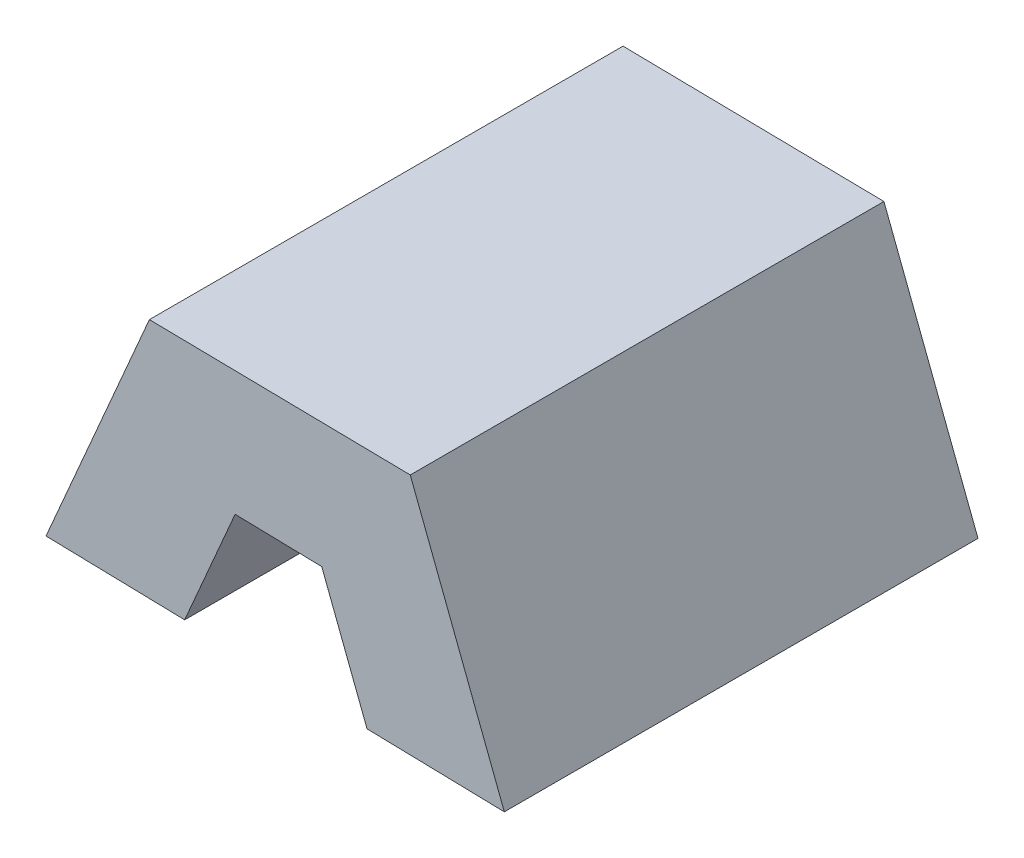
ISO-10303-21;
HEADER;
FILE_DESCRIPTION(('STEP AP214'),'2;1');
FILE_NAME('part.step','',(''),(''),'','','');
FILE_SCHEMA(('AUTOMOTIVE_DESIGN { 1 0 10303 214 1 1 1 1 }'));
ENDSEC;
DATA;
#1=APPLICATION_CONTEXT('core data for automotive mechanical design processes');
#2=APPLICATION_PROTOCOL_DEFINITION('international standard','automotive_design',2000,#1);
#3=PRODUCT_CONTEXT('',#1,'mechanical');
#4=PRODUCT('Part','Part','',(#3));
#5=PRODUCT_RELATED_PRODUCT_CATEGORY('part','',(#4));
#6=PRODUCT_DEFINITION_FORMATION('','',#4);
#7=PRODUCT_DEFINITION_CONTEXT('part definition',#1,'design');
#8=PRODUCT_DEFINITION('design','',#6,#7);
#9=PRODUCT_DEFINITION_SHAPE('','',#8);
#10=(LENGTH_UNIT() NAMED_UNIT(*) SI_UNIT(.MILLI.,.METRE.));
#11=(NAMED_UNIT(*) PLANE_ANGLE_UNIT() SI_UNIT($,.RADIAN.));
#12=(NAMED_UNIT(*) SI_UNIT($,.STERADIAN.) SOLID_ANGLE_UNIT());
#13=UNCERTAINTY_MEASURE_WITH_UNIT(LENGTH_MEASURE(1.E-05),#10,'distance_accuracy_value','');
#14=(GEOMETRIC_REPRESENTATION_CONTEXT(3) GLOBAL_UNCERTAINTY_ASSIGNED_CONTEXT((#13)) GLOBAL_UNIT_ASSIGNED_CONTEXT((#10,
#11,#12)) REPRESENTATION_CONTEXT('',''));
#15=CARTESIAN_POINT('',(0.,0.,0.));
#16=DIRECTION('',(0.,0.,1.));
#17=DIRECTION('',(1.,0.,0.));
#18=AXIS2_PLACEMENT_3D('',#15,#16,#17);
#19=CARTESIAN_POINT('',(5.710139457628,1.240783037333,0.));
#20=DIRECTION('',(-0.917874415525835,0.396870958024277,0.));
#21=DIRECTION('',(-0.396870958024277,-0.917874415525835,0.));
#22=AXIS2_PLACEMENT_3D('',#19,#20,#21);
#23=PLANE('',#22);
#24=DIRECTION('',(-0.396870958024277,-0.917874415525835,0.));
#25=VECTOR('',#24,1.);
#26=CARTESIAN_POINT('',(5.710139457628,1.240783037333,0.));
#27=LINE('',#26,#25);
#28=CARTESIAN_POINT('',(5.710139457628,1.240783037333,0.));
#29=VERTEX_POINT('',#28);
#30=CARTESIAN_POINT('',(5.688309723282,1.190295708267,0.));
#31=VERTEX_POINT('',#30);
#32=EDGE_CURVE('E11',#29,#31,#27,.T.);
#33=ORIENTED_EDGE('',*,*,#32,.T.);
#34=DIRECTION('',(0.,0.,1.));
#35=VECTOR('',#34,1.);
#36=CARTESIAN_POINT('',(5.688309723282,1.190295708267,0.));
#37=LINE('',#36,#35);
#38=CARTESIAN_POINT('',(5.688309723282,1.190295708267,0.1));
#39=VERTEX_POINT('',#38);
#40=EDGE_CURVE('E24',#31,#39,#37,.T.);
#41=ORIENTED_EDGE('',*,*,#40,.T.);
#42=DIRECTION('',(-0.396870958024277,-0.917874415525835,0.));
#43=VECTOR('',#42,1.);
#44=CARTESIAN_POINT('',(5.710139457628,1.240783037333,0.1));
#45=LINE('',#44,#43);
#46=CARTESIAN_POINT('',(5.710139457628,1.240783037333,0.1));
#47=VERTEX_POINT('',#46);
#48=EDGE_CURVE('E100',#47,#39,#45,.T.);
#49=ORIENTED_EDGE('',*,*,#48,.F.);
#50=DIRECTION('',(0.,0.,1.));
#51=VECTOR('',#50,1.);
#52=CARTESIAN_POINT('',(5.710139457628,1.240783037333,0.));
#53=LINE('',#52,#51);
#54=EDGE_CURVE('E146',#29,#47,#53,.T.);
#55=ORIENTED_EDGE('',*,*,#54,.F.);
#56=EDGE_LOOP('',(#33,#41,#49,#55));
#57=FACE_BOUND('',#56,.T.);
#58=ADVANCED_FACE('F17',(#57),#23,.T.);
#59=CARTESIAN_POINT('',(5.765214409801,1.23991646644,0.));
#60=DIRECTION('',(0.015732444769395,0.999876237432203,0.));
#61=DIRECTION('',(-0.999876237432203,0.015732444769395,0.));
#62=AXIS2_PLACEMENT_3D('',#59,#60,#61);
#63=PLANE('',#62);
#64=DIRECTION('',(-0.999876237432202,0.015732444769395,0.));
#65=VECTOR('',#64,1.);
#66=CARTESIAN_POINT('',(5.765214409801,1.23991646644,0.));
#67=LINE('',#66,#65);
#68=CARTESIAN_POINT('',(5.765214409801,1.23991646644,0.));
#69=VERTEX_POINT('',#68);
#70=EDGE_CURVE('E143',#69,#29,#67,.T.);
#71=ORIENTED_EDGE('',*,*,#70,.T.);
#72=ORIENTED_EDGE('',*,*,#54,.T.);
#73=DIRECTION('',(-0.999876237432202,0.015732444769395,0.));
#74=VECTOR('',#73,1.);
#75=CARTESIAN_POINT('',(5.765214409801,1.23991646644,0.1));
#76=LINE('',#75,#74);
#77=CARTESIAN_POINT('',(5.765214409801,1.23991646644,0.1));
#78=VERTEX_POINT('',#77);
#79=EDGE_CURVE('E141',#78,#47,#76,.T.);
#80=ORIENTED_EDGE('',*,*,#79,.F.);
#81=DIRECTION('',(0.,0.,1.));
#82=VECTOR('',#81,1.);
#83=CARTESIAN_POINT('',(5.765214409801,1.23991646644,0.));
#84=LINE('',#83,#82);
#85=EDGE_CURVE('E138',#69,#78,#84,.T.);
#86=ORIENTED_EDGE('',*,*,#85,.F.);
#87=EDGE_LOOP('',(#71,#72,#80,#86));
#88=FACE_BOUND('',#87,.T.);
#89=ADVANCED_FACE('F163',(#88),#63,.T.);
#90=CARTESIAN_POINT('',(5.785077541977,1.188245252047,0.));
#91=DIRECTION('',(0.933408609369541,0.35881522815346,0.));
#92=DIRECTION('',(-0.35881522815346,0.933408609369541,0.));
#93=AXIS2_PLACEMENT_3D('',#90,#91,#92);
#94=PLANE('',#93);
#95=DIRECTION('',(-0.35881522815346,0.933408609369541,0.));
#96=VECTOR('',#95,1.);
#97=CARTESIAN_POINT('',(5.785077541977,1.188245252047,0.));
#98=LINE('',#97,#96);
#99=CARTESIAN_POINT('',(5.785077541977,1.188245252047,0.));
#100=VERTEX_POINT('',#99);
#101=EDGE_CURVE('E135',#100,#69,#98,.T.);
#102=ORIENTED_EDGE('',*,*,#101,.T.);
#103=ORIENTED_EDGE('',*,*,#85,.T.);
#104=DIRECTION('',(-0.35881522815346,0.933408609369541,0.));
#105=VECTOR('',#104,1.);
#106=CARTESIAN_POINT('',(5.785077541977,1.188245252047,0.1));
#107=LINE('',#106,#105);
#108=CARTESIAN_POINT('',(5.785077541977,1.188245252047,0.1));
#109=VERTEX_POINT('',#108);
#110=EDGE_CURVE('E132',#109,#78,#107,.T.);
#111=ORIENTED_EDGE('',*,*,#110,.F.);
#112=DIRECTION('',(0.,0.,1.));
#113=VECTOR('',#112,1.);
#114=CARTESIAN_POINT('',(5.785077541977,1.188245252047,0.));
#115=LINE('',#114,#113);
#116=EDGE_CURVE('E129',#100,#109,#115,.T.);
#117=ORIENTED_EDGE('',*,*,#116,.F.);
#118=EDGE_LOOP('',(#102,#103,#111,#117));
#119=FACE_BOUND('',#118,.T.);
#120=ADVANCED_FACE('F160',(#119),#94,.T.);
#121=CARTESIAN_POINT('',(5.756089852152,1.188928770704,0.));
#122=DIRECTION('',(-0.023573065766465,-0.999722116675614,0.));
#123=DIRECTION('',(0.999722116675614,-0.023573065766465,0.));
#124=AXIS2_PLACEMENT_3D('',#121,#122,#123);
#125=PLANE('',#124);
#126=DIRECTION('',(0.999722116675614,-0.023573065766465,0.));
#127=VECTOR('',#126,1.);
#128=CARTESIAN_POINT('',(5.756089852152,1.188928770704,0.));
#129=LINE('',#128,#127);
#130=CARTESIAN_POINT('',(5.756089852152,1.188928770704,0.));
#131=VERTEX_POINT('',#130);
#132=EDGE_CURVE('E126',#131,#100,#129,.T.);
#133=ORIENTED_EDGE('',*,*,#132,.T.);
#134=ORIENTED_EDGE('',*,*,#116,.T.);
#135=DIRECTION('',(0.999722116675614,-0.023573065766465,0.));
#136=VECTOR('',#135,1.);
#137=CARTESIAN_POINT('',(5.756089852152,1.188928770704,0.1));
#138=LINE('',#137,#136);
#139=CARTESIAN_POINT('',(5.756089852152,1.188928770704,0.1));
#140=VERTEX_POINT('',#139);
#141=EDGE_CURVE('E123',#140,#109,#138,.T.);
#142=ORIENTED_EDGE('',*,*,#141,.F.);
#143=DIRECTION('',(0.,0.,1.));
#144=VECTOR('',#143,1.);
#145=CARTESIAN_POINT('',(5.756089852152,1.188928770704,0.));
#146=LINE('',#145,#144);
#147=EDGE_CURVE('E120',#131,#140,#146,.T.);
#148=ORIENTED_EDGE('',*,*,#147,.F.);
#149=EDGE_LOOP('',(#133,#134,#142,#148));
#150=FACE_BOUND('',#149,.T.);
#151=ADVANCED_FACE('F157',(#150),#125,.T.);
#152=CARTESIAN_POINT('',(5.746525469888,1.213809199536,0.));
#153=DIRECTION('',(-0.933408609369533,-0.35881522815348,0.));
#154=DIRECTION('',(0.35881522815348,-0.933408609369533,0.));
#155=AXIS2_PLACEMENT_3D('',#152,#153,#154);
#156=PLANE('',#155);
#157=DIRECTION('',(0.35881522815348,-0.933408609369533,0.));
#158=VECTOR('',#157,1.);
#159=CARTESIAN_POINT('',(5.746525469888,1.213809199536,0.));
#160=LINE('',#159,#158);
#161=CARTESIAN_POINT('',(5.746525469888,1.213809199536,0.));
#162=VERTEX_POINT('',#161);
#163=EDGE_CURVE('E117',#162,#131,#160,.T.);
#164=ORIENTED_EDGE('',*,*,#163,.T.);
#165=ORIENTED_EDGE('',*,*,#147,.T.);
#166=DIRECTION('',(0.35881522815348,-0.933408609369533,0.));
#167=VECTOR('',#166,1.);
#168=CARTESIAN_POINT('',(5.746525469888,1.213809199536,0.1));
#169=LINE('',#168,#167);
#170=CARTESIAN_POINT('',(5.746525469888,1.213809199536,0.1));
#171=VERTEX_POINT('',#170);
#172=EDGE_CURVE('E114',#171,#140,#169,.T.);
#173=ORIENTED_EDGE('',*,*,#172,.F.);
#174=DIRECTION('',(0.,0.,1.));
#175=VECTOR('',#174,1.);
#176=CARTESIAN_POINT('',(5.746525469888,1.213809199536,0.));
#177=LINE('',#176,#175);
#178=EDGE_CURVE('E111',#162,#171,#177,.T.);
#179=ORIENTED_EDGE('',*,*,#178,.F.);
#180=EDGE_LOOP('',(#164,#165,#173,#179));
#181=FACE_BOUND('',#180,.T.);
#182=ADVANCED_FACE('F154',(#181),#156,.T.);
#183=CARTESIAN_POINT('',(5.728239292055,1.214240380626,0.));
#184=DIRECTION('',(-0.02357306576646,-0.999722116675614,0.));
#185=DIRECTION('',(0.999722116675614,-0.02357306576646,0.));
#186=AXIS2_PLACEMENT_3D('',#183,#184,#185);
#187=PLANE('',#186);
#188=DIRECTION('',(0.999722116675614,-0.02357306576646,0.));
#189=VECTOR('',#188,1.);
#190=CARTESIAN_POINT('',(5.728239292055,1.214240380626,0.));
#191=LINE('',#190,#189);
#192=CARTESIAN_POINT('',(5.728239292055,1.214240380626,0.));
#193=VERTEX_POINT('',#192);
#194=EDGE_CURVE('E108',#193,#162,#191,.T.);
#195=ORIENTED_EDGE('',*,*,#194,.T.);
#196=ORIENTED_EDGE('',*,*,#178,.T.);
#197=DIRECTION('',(0.999722116675614,-0.02357306576646,0.));
#198=VECTOR('',#197,1.);
#199=CARTESIAN_POINT('',(5.728239292055,1.214240380626,0.1));
#200=LINE('',#199,#198);
#201=CARTESIAN_POINT('',(5.728239292055,1.214240380626,0.1));
#202=VERTEX_POINT('',#201);
#203=EDGE_CURVE('E106',#202,#171,#200,.T.);
#204=ORIENTED_EDGE('',*,*,#203,.F.);
#205=DIRECTION('',(0.,0.,1.));
#206=VECTOR('',#205,1.);
#207=CARTESIAN_POINT('',(5.728239292055,1.214240380626,0.));
#208=LINE('',#207,#206);
#209=EDGE_CURVE('E85',#193,#202,#208,.T.);
#210=ORIENTED_EDGE('',*,*,#209,.F.);
#211=EDGE_LOOP('',(#195,#196,#204,#210));
#212=FACE_BOUND('',#211,.T.);
#213=ADVANCED_FACE('F152',(#212),#187,.T.);
#214=CARTESIAN_POINT('',(5.717587585191,1.189605347463,0.));
#215=DIRECTION('',(0.917874415525831,-0.396870958024285,0.));
#216=DIRECTION('',(0.396870958024285,0.917874415525831,0.));
#217=AXIS2_PLACEMENT_3D('',#214,#215,#216);
#218=PLANE('',#217);
#219=DIRECTION('',(0.396870958024285,0.917874415525831,0.));
#220=VECTOR('',#219,1.);
#221=CARTESIAN_POINT('',(5.717587585191,1.189605347463,0.));
#222=LINE('',#221,#220);
#223=CARTESIAN_POINT('',(5.717587585191,1.189605347463,0.));
#224=VERTEX_POINT('',#223);
#225=EDGE_CURVE('E89',#224,#193,#222,.T.);
#226=ORIENTED_EDGE('',*,*,#225,.T.);
#227=ORIENTED_EDGE('',*,*,#209,.T.);
#228=DIRECTION('',(0.396870958024285,0.917874415525831,0.));
#229=VECTOR('',#228,1.);
#230=CARTESIAN_POINT('',(5.717587585191,1.189605347463,0.1));
#231=LINE('',#230,#229);
#232=CARTESIAN_POINT('',(5.717587585191,1.189605347463,0.1));
#233=VERTEX_POINT('',#232);
#234=EDGE_CURVE('E78',#233,#202,#231,.T.);
#235=ORIENTED_EDGE('',*,*,#234,.F.);
#236=DIRECTION('',(0.,0.,1.));
#237=VECTOR('',#236,1.);
#238=CARTESIAN_POINT('',(5.717587585191,1.189605347463,0.));
#239=LINE('',#238,#237);
#240=EDGE_CURVE('E82',#224,#233,#239,.T.);
#241=ORIENTED_EDGE('',*,*,#240,.F.);
#242=EDGE_LOOP('',(#226,#227,#235,#241));
#243=FACE_BOUND('',#242,.T.);
#244=ADVANCED_FACE('F81',(#243),#218,.T.);
#245=CARTESIAN_POINT('',(5.688309723282,1.190295708267,0.));
#246=DIRECTION('',(-0.023573065766469,-0.999722116675614,0.));
#247=DIRECTION('',(0.999722116675614,-0.023573065766469,0.));
#248=AXIS2_PLACEMENT_3D('',#245,#246,#247);
#249=PLANE('',#248);
#250=DIRECTION('',(0.999722116675614,-0.023573065766469,0.));
#251=VECTOR('',#250,1.);
#252=CARTESIAN_POINT('',(5.688309723282,1.190295708267,0.));
#253=LINE('',#252,#251);
#254=EDGE_CURVE('E95',#31,#224,#253,.T.);
#255=ORIENTED_EDGE('',*,*,#254,.T.);
#256=ORIENTED_EDGE('',*,*,#240,.T.);
#257=DIRECTION('',(0.999722116675614,-0.023573065766469,0.));
#258=VECTOR('',#257,1.);
#259=CARTESIAN_POINT('',(5.688309723282,1.190295708267,0.1));
#260=LINE('',#259,#258);
#261=EDGE_CURVE('E94',#39,#233,#260,.T.);
#262=ORIENTED_EDGE('',*,*,#261,.F.);
#263=ORIENTED_EDGE('',*,*,#40,.F.);
#264=EDGE_LOOP('',(#255,#256,#262,#263));
#265=FACE_BOUND('',#264,.T.);
#266=ADVANCED_FACE('F93',(#265),#249,.T.);
#267=CARTESIAN_POINT('',(5.737196230541,1.212101548104,0.1));
#268=DIRECTION('',(0.,0.,1.));
#269=DIRECTION('',(1.,0.,0.));
#270=AXIS2_PLACEMENT_3D('',#267,#268,#269);
#271=PLANE('',#270);
#272=ORIENTED_EDGE('',*,*,#261,.T.);
#273=ORIENTED_EDGE('',*,*,#234,.T.);
#274=ORIENTED_EDGE('',*,*,#203,.T.);
#275=ORIENTED_EDGE('',*,*,#172,.T.);
#276=ORIENTED_EDGE('',*,*,#141,.T.);
#277=ORIENTED_EDGE('',*,*,#110,.T.);
#278=ORIENTED_EDGE('',*,*,#79,.T.);
#279=ORIENTED_EDGE('',*,*,#48,.T.);
#280=EDGE_LOOP('',(#272,#273,#274,#275,#276,#277,#278,#279));
#281=FACE_BOUND('',#280,.T.);
#282=ADVANCED_FACE('F98',(#281),#271,.T.);
#283=CARTESIAN_POINT('',(5.737196230541,1.212101548104,0.));
#284=DIRECTION('',(0.,0.,1.));
#285=DIRECTION('',(1.,0.,0.));
#286=AXIS2_PLACEMENT_3D('',#283,#284,#285);
#287=PLANE('',#286);
#288=ORIENTED_EDGE('',*,*,#254,.F.);
#289=ORIENTED_EDGE('',*,*,#32,.F.);
#290=ORIENTED_EDGE('',*,*,#70,.F.);
#291=ORIENTED_EDGE('',*,*,#101,.F.);
#292=ORIENTED_EDGE('',*,*,#132,.F.);
#293=ORIENTED_EDGE('',*,*,#163,.F.);
#294=ORIENTED_EDGE('',*,*,#194,.F.);
#295=ORIENTED_EDGE('',*,*,#225,.F.);
#296=EDGE_LOOP('',(#288,#289,#290,#291,#292,#293,#294,#295));
#297=FACE_BOUND('',#296,.T.);
#298=ADVANCED_FACE('F149',(#297),#287,.F.);
#299=CLOSED_SHELL('',(#58,#89,#120,#151,#182,#213,#244,#266,#282,#298));
#300=MANIFOLD_SOLID_BREP('B1',#299);
#301=ADVANCED_BREP_SHAPE_REPRESENTATION('',(#18,#300),#14);
#302=SHAPE_DEFINITION_REPRESENTATION(#9,#301);
ENDSEC;
END-ISO-10303-21;
